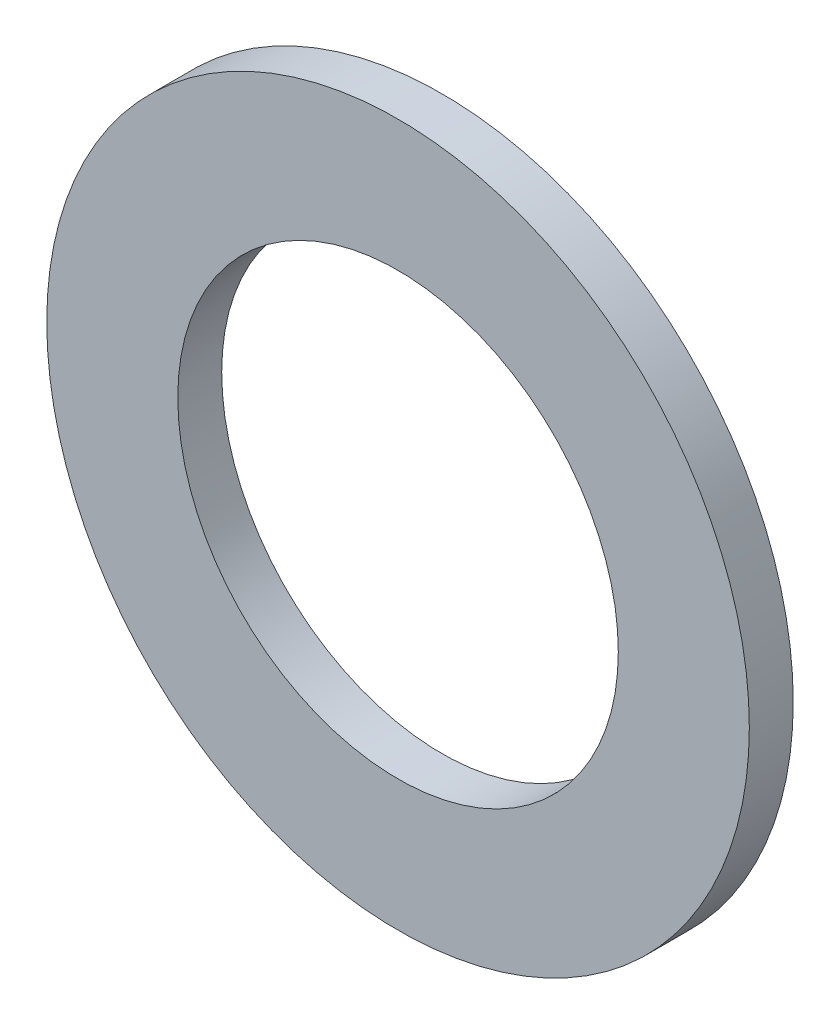
ISO-10303-21;
HEADER;
FILE_DESCRIPTION(('STEP AP214'),'2;1');
FILE_NAME('part.step','',(''),(''),'','','');
FILE_SCHEMA(('AUTOMOTIVE_DESIGN { 1 0 10303 214 1 1 1 1 }'));
ENDSEC;
DATA;
#1=APPLICATION_CONTEXT('core data for automotive mechanical design processes');
#2=APPLICATION_PROTOCOL_DEFINITION('international standard','automotive_design',2000,#1);
#3=PRODUCT_CONTEXT('',#1,'mechanical');
#4=PRODUCT('Part','Part','',(#3));
#5=PRODUCT_RELATED_PRODUCT_CATEGORY('part','',(#4));
#6=PRODUCT_DEFINITION_FORMATION('','',#4);
#7=PRODUCT_DEFINITION_CONTEXT('part definition',#1,'design');
#8=PRODUCT_DEFINITION('design','',#6,#7);
#9=PRODUCT_DEFINITION_SHAPE('','',#8);
#10=(LENGTH_UNIT() NAMED_UNIT(*) SI_UNIT(.MILLI.,.METRE.));
#11=(NAMED_UNIT(*) PLANE_ANGLE_UNIT() SI_UNIT($,.RADIAN.));
#12=(NAMED_UNIT(*) SI_UNIT($,.STERADIAN.) SOLID_ANGLE_UNIT());
#13=UNCERTAINTY_MEASURE_WITH_UNIT(LENGTH_MEASURE(1.E-05),#10,'distance_accuracy_value','');
#14=(GEOMETRIC_REPRESENTATION_CONTEXT(3) GLOBAL_UNCERTAINTY_ASSIGNED_CONTEXT((#13)) GLOBAL_UNIT_ASSIGNED_CONTEXT((#10,
#11,#12)) REPRESENTATION_CONTEXT('',''));
#15=CARTESIAN_POINT('',(0.,0.,0.));
#16=DIRECTION('',(0.,0.,1.));
#17=DIRECTION('',(1.,0.,0.));
#18=AXIS2_PLACEMENT_3D('',#15,#16,#17);
#19=CARTESIAN_POINT('',(0.,0.,0.79375));
#20=DIRECTION('',(0.,0.,1.));
#21=DIRECTION('',(1.,0.,0.));
#22=AXIS2_PLACEMENT_3D('',#19,#20,#21);
#23=PLANE('',#22);
#24=CARTESIAN_POINT('',(0.,0.,0.79375));
#25=DIRECTION('',(0.,0.,1.));
#26=DIRECTION('',(1.,0.,0.));
#27=AXIS2_PLACEMENT_3D('',#24,#25,#26);
#28=CIRCLE('',#27,12.7);
#29=CARTESIAN_POINT('',(12.7,0.,0.79375));
#30=VERTEX_POINT('',#29);
#31=EDGE_CURVE('E10',#30,#30,#28,.T.);
#32=ORIENTED_EDGE('',*,*,#31,.T.);
#33=EDGE_LOOP('',(#32));
#34=FACE_BOUND('',#33,.T.);
#35=CARTESIAN_POINT('',(0.,0.,0.79375));
#36=DIRECTION('',(0.,0.,1.));
#37=DIRECTION('',(1.,0.,0.));
#38=AXIS2_PLACEMENT_3D('',#35,#36,#37);
#39=CIRCLE('',#38,7.9629);
#40=CARTESIAN_POINT('',(7.9629,0.,0.79375));
#41=VERTEX_POINT('',#40);
#42=EDGE_CURVE('E48',#41,#41,#39,.T.);
#43=ORIENTED_EDGE('',*,*,#42,.F.);
#44=EDGE_LOOP('',(#43));
#45=FACE_BOUND('',#44,.T.);
#46=ADVANCED_FACE('F37',(#34,#45),#23,.T.);
#47=CARTESIAN_POINT('',(0.,0.,-0.79375));
#48=DIRECTION('',(0.,0.,1.));
#49=DIRECTION('',(1.,0.,0.));
#50=AXIS2_PLACEMENT_3D('',#47,#48,#49);
#51=PLANE('',#50);
#52=CARTESIAN_POINT('',(0.,0.,-0.79375));
#53=DIRECTION('',(0.,0.,1.));
#54=DIRECTION('',(1.,0.,0.));
#55=AXIS2_PLACEMENT_3D('',#52,#53,#54);
#56=CIRCLE('',#55,12.7);
#57=CARTESIAN_POINT('',(12.7,0.,-0.79375));
#58=VERTEX_POINT('',#57);
#59=EDGE_CURVE('E41',#58,#58,#56,.T.);
#60=ORIENTED_EDGE('',*,*,#59,.F.);
#61=EDGE_LOOP('',(#60));
#62=FACE_BOUND('',#61,.T.);
#63=CARTESIAN_POINT('',(0.,0.,-0.79375));
#64=DIRECTION('',(0.,0.,1.));
#65=DIRECTION('',(1.,0.,0.));
#66=AXIS2_PLACEMENT_3D('',#63,#64,#65);
#67=CIRCLE('',#66,7.9629);
#68=CARTESIAN_POINT('',(7.9629,0.,-0.79375));
#69=VERTEX_POINT('',#68);
#70=EDGE_CURVE('E50',#69,#69,#67,.T.);
#71=ORIENTED_EDGE('',*,*,#70,.T.);
#72=EDGE_LOOP('',(#71));
#73=FACE_BOUND('',#72,.T.);
#74=ADVANCED_FACE('F60',(#62,#73),#51,.F.);
#75=CARTESIAN_POINT('',(0.,0.,0.79375));
#76=DIRECTION('',(0.,0.,-1.));
#77=DIRECTION('',(-1.,0.,0.));
#78=AXIS2_PLACEMENT_3D('',#75,#76,#77);
#79=CYLINDRICAL_SURFACE('',#78,12.7);
#80=ORIENTED_EDGE('',*,*,#31,.F.);
#81=EDGE_LOOP('',(#80));
#82=FACE_BOUND('',#81,.T.);
#83=ORIENTED_EDGE('',*,*,#59,.T.);
#84=EDGE_LOOP('',(#83));
#85=FACE_BOUND('',#84,.T.);
#86=ADVANCED_FACE('F39',(#82,#85),#79,.T.);
#87=CARTESIAN_POINT('',(0.,0.,0.79375));
#88=DIRECTION('',(0.,0.,-1.));
#89=DIRECTION('',(-1.,0.,0.));
#90=AXIS2_PLACEMENT_3D('',#87,#88,#89);
#91=CYLINDRICAL_SURFACE('',#90,7.9629);
#92=ORIENTED_EDGE('',*,*,#42,.T.);
#93=EDGE_LOOP('',(#92));
#94=FACE_BOUND('',#93,.T.);
#95=ORIENTED_EDGE('',*,*,#70,.F.);
#96=EDGE_LOOP('',(#95));
#97=FACE_BOUND('',#96,.T.);
#98=ADVANCED_FACE('F56',(#94,#97),#91,.F.);
#99=CLOSED_SHELL('',(#46,#74,#86,#98));
#100=MANIFOLD_SOLID_BREP('B2',#99);
#101=ADVANCED_BREP_SHAPE_REPRESENTATION('',(#18,#100),#14);
#102=SHAPE_DEFINITION_REPRESENTATION(#9,#101);
ENDSEC;
END-ISO-10303-21;
